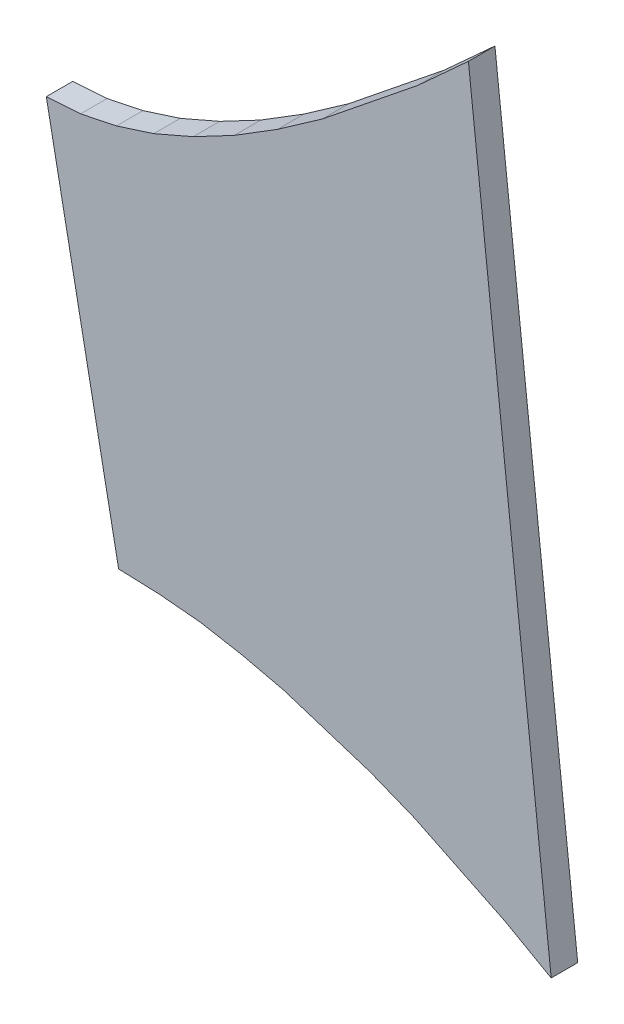
ISO-10303-21;
HEADER;
FILE_DESCRIPTION(('STEP AP214'),'2;1');
FILE_NAME('part.step','',(''),(''),'','','');
FILE_SCHEMA(('AUTOMOTIVE_DESIGN { 1 0 10303 214 1 1 1 1 }'));
ENDSEC;
DATA;
#1=APPLICATION_CONTEXT('core data for automotive mechanical design processes');
#2=APPLICATION_PROTOCOL_DEFINITION('international standard','automotive_design',2000,#1);
#3=PRODUCT_CONTEXT('',#1,'mechanical');
#4=PRODUCT('Part','Part','',(#3));
#5=PRODUCT_RELATED_PRODUCT_CATEGORY('part','',(#4));
#6=PRODUCT_DEFINITION_FORMATION('','',#4);
#7=PRODUCT_DEFINITION_CONTEXT('part definition',#1,'design');
#8=PRODUCT_DEFINITION('design','',#6,#7);
#9=PRODUCT_DEFINITION_SHAPE('','',#8);
#10=(LENGTH_UNIT() NAMED_UNIT(*) SI_UNIT(.MILLI.,.METRE.));
#11=(NAMED_UNIT(*) PLANE_ANGLE_UNIT() SI_UNIT($,.RADIAN.));
#12=(NAMED_UNIT(*) SI_UNIT($,.STERADIAN.) SOLID_ANGLE_UNIT());
#13=UNCERTAINTY_MEASURE_WITH_UNIT(LENGTH_MEASURE(1.E-05),#10,'distance_accuracy_value','');
#14=(GEOMETRIC_REPRESENTATION_CONTEXT(3) GLOBAL_UNCERTAINTY_ASSIGNED_CONTEXT((#13)) GLOBAL_UNIT_ASSIGNED_CONTEXT((#10,
#11,#12)) REPRESENTATION_CONTEXT('',''));
#15=CARTESIAN_POINT('',(0.,0.,0.));
#16=DIRECTION('',(0.,0.,1.));
#17=DIRECTION('',(1.,0.,0.));
#18=AXIS2_PLACEMENT_3D('',#15,#16,#17);
#19=CARTESIAN_POINT('',(49.7750015258789,85.5899963378906,0.));
#20=DIRECTION('',(0.0369933823763517,0.999315510567287,0.));
#21=DIRECTION('',(0.999315510567287,-0.0369933823763517,0.));
#22=AXIS2_PLACEMENT_3D('',#19,#20,#21);
#23=PLANE('',#22);
#24=DIRECTION('',(0.999315510567287,-0.0369933823763517,0.));
#25=VECTOR('',#24,1.);
#26=CARTESIAN_POINT('',(49.7750015258789,85.5899963378906,0.03556));
#27=LINE('',#26,#25);
#28=CARTESIAN_POINT('',(49.7750015258789,85.5899963378906,0.03556));
#29=VERTEX_POINT('',#28);
#30=CARTESIAN_POINT('',(49.8289985656738,85.5879974365234,0.03556));
#31=VERTEX_POINT('',#30);
#32=EDGE_CURVE('E11',#29,#31,#27,.T.);
#33=ORIENTED_EDGE('',*,*,#32,.F.);
#34=DIRECTION('',(0.,0.,1.));
#35=VECTOR('',#34,1.);
#36=CARTESIAN_POINT('',(49.7750015258789,85.5899963378906,0.));
#37=LINE('',#36,#35);
#38=CARTESIAN_POINT('',(49.7750015258789,85.5899963378906,0.));
#39=VERTEX_POINT('',#38);
#40=EDGE_CURVE('E24',#39,#29,#37,.T.);
#41=ORIENTED_EDGE('',*,*,#40,.F.);
#42=DIRECTION('',(0.999315510567287,-0.0369933823763517,0.));
#43=VECTOR('',#42,1.);
#44=CARTESIAN_POINT('',(49.7750015258789,85.5899963378906,0.));
#45=LINE('',#44,#43);
#46=CARTESIAN_POINT('',(49.8289985656738,85.5879974365234,0.));
#47=VERTEX_POINT('',#46);
#48=EDGE_CURVE('E166',#39,#47,#45,.T.);
#49=ORIENTED_EDGE('',*,*,#48,.T.);
#50=DIRECTION('',(0.,0.,1.));
#51=VECTOR('',#50,1.);
#52=CARTESIAN_POINT('',(49.8289985656738,85.5879974365234,0.));
#53=LINE('',#52,#51);
#54=EDGE_CURVE('E37',#47,#31,#53,.T.);
#55=ORIENTED_EDGE('',*,*,#54,.T.);
#56=EDGE_LOOP('',(#33,#41,#49,#55));
#57=FACE_BOUND('',#56,.T.);
#58=ADVANCED_FACE('F17',(#57),#23,.F.);
#59=CARTESIAN_POINT('',(49.8289985656738,85.5879974365234,0.));
#60=DIRECTION('',(0.090485922620555,0.995897734613101,0.));
#61=DIRECTION('',(0.995897734613101,-0.090485922620555,0.));
#62=AXIS2_PLACEMENT_3D('',#59,#60,#61);
#63=PLANE('',#62);
#64=DIRECTION('',(0.995897734613101,-0.090485922620555,0.));
#65=VECTOR('',#64,1.);
#66=CARTESIAN_POINT('',(49.8289985656738,85.5879974365234,0.03556));
#67=LINE('',#66,#65);
#68=CARTESIAN_POINT('',(49.8839988708496,85.5830001831055,0.03556));
#69=VERTEX_POINT('',#68);
#70=EDGE_CURVE('E294',#31,#69,#67,.T.);
#71=ORIENTED_EDGE('',*,*,#70,.F.);
#72=ORIENTED_EDGE('',*,*,#54,.F.);
#73=DIRECTION('',(0.995897734613101,-0.090485922620555,0.));
#74=VECTOR('',#73,1.);
#75=CARTESIAN_POINT('',(49.8289985656738,85.5879974365234,0.));
#76=LINE('',#75,#74);
#77=CARTESIAN_POINT('',(49.8839988708496,85.5830001831055,0.));
#78=VERTEX_POINT('',#77);
#79=EDGE_CURVE('E291',#47,#78,#76,.T.);
#80=ORIENTED_EDGE('',*,*,#79,.T.);
#81=DIRECTION('',(0.,0.,1.));
#82=VECTOR('',#81,1.);
#83=CARTESIAN_POINT('',(49.8839988708496,85.5830001831055,0.));
#84=LINE('',#83,#82);
#85=EDGE_CURVE('E289',#78,#69,#84,.T.);
#86=ORIENTED_EDGE('',*,*,#85,.T.);
#87=EDGE_LOOP('',(#71,#72,#80,#86));
#88=FACE_BOUND('',#87,.T.);
#89=ADVANCED_FACE('F302',(#88),#63,.F.);
#90=CARTESIAN_POINT('',(49.8839988708496,85.5830001831055,0.));
#91=DIRECTION('',(0.175827773431546,0.984420943545039,0.));
#92=DIRECTION('',(0.984420943545039,-0.175827773431546,0.));
#93=AXIS2_PLACEMENT_3D('',#90,#91,#92);
#94=PLANE('',#93);
#95=DIRECTION('',(0.984420943545039,-0.175827773431546,0.));
#96=VECTOR('',#95,1.);
#97=CARTESIAN_POINT('',(49.8839988708496,85.5830001831055,0.03556));
#98=LINE('',#97,#96);
#99=CARTESIAN_POINT('',(49.939998626709,85.572998046875,0.03556));
#100=VERTEX_POINT('',#99);
#101=EDGE_CURVE('E286',#69,#100,#98,.T.);
#102=ORIENTED_EDGE('',*,*,#101,.F.);
#103=ORIENTED_EDGE('',*,*,#85,.F.);
#104=DIRECTION('',(0.984420943545039,-0.175827773431546,0.));
#105=VECTOR('',#104,1.);
#106=CARTESIAN_POINT('',(49.8839988708496,85.5830001831055,0.));
#107=LINE('',#106,#105);
#108=CARTESIAN_POINT('',(49.939998626709,85.572998046875,0.));
#109=VERTEX_POINT('',#108);
#110=EDGE_CURVE('E283',#78,#109,#107,.T.);
#111=ORIENTED_EDGE('',*,*,#110,.T.);
#112=DIRECTION('',(0.,0.,1.));
#113=VECTOR('',#112,1.);
#114=CARTESIAN_POINT('',(49.939998626709,85.572998046875,0.));
#115=LINE('',#114,#113);
#116=EDGE_CURVE('E281',#109,#100,#115,.T.);
#117=ORIENTED_EDGE('',*,*,#116,.T.);
#118=EDGE_LOOP('',(#102,#103,#111,#117));
#119=FACE_BOUND('',#118,.T.);
#120=ADVANCED_FACE('F308',(#119),#94,.F.);
#121=CARTESIAN_POINT('',(49.939998626709,85.572998046875,0.));
#122=DIRECTION('',(0.226138701789796,0.974095112169662,0.));
#123=DIRECTION('',(0.974095112169662,-0.226138701789796,0.));
#124=AXIS2_PLACEMENT_3D('',#121,#122,#123);
#125=PLANE('',#124);
#126=DIRECTION('',(0.974095112169662,-0.226138701789796,0.));
#127=VECTOR('',#126,1.);
#128=CARTESIAN_POINT('',(49.939998626709,85.572998046875,0.03556));
#129=LINE('',#128,#127);
#130=CARTESIAN_POINT('',(49.9959983825684,85.5599975585938,0.03556));
#131=VERTEX_POINT('',#130);
#132=EDGE_CURVE('E278',#100,#131,#129,.T.);
#133=ORIENTED_EDGE('',*,*,#132,.F.);
#134=ORIENTED_EDGE('',*,*,#116,.F.);
#135=DIRECTION('',(0.974095112169662,-0.226138701789796,0.));
#136=VECTOR('',#135,1.);
#137=CARTESIAN_POINT('',(49.939998626709,85.572998046875,0.));
#138=LINE('',#137,#136);
#139=CARTESIAN_POINT('',(49.9959983825684,85.5599975585938,0.));
#140=VERTEX_POINT('',#139);
#141=EDGE_CURVE('E275',#109,#140,#138,.T.);
#142=ORIENTED_EDGE('',*,*,#141,.T.);
#143=DIRECTION('',(0.,0.,1.));
#144=VECTOR('',#143,1.);
#145=CARTESIAN_POINT('',(49.9959983825684,85.5599975585938,0.));
#146=LINE('',#145,#144);
#147=EDGE_CURVE('E273',#140,#131,#146,.T.);
#148=ORIENTED_EDGE('',*,*,#147,.T.);
#149=EDGE_LOOP('',(#133,#134,#142,#148));
#150=FACE_BOUND('',#149,.T.);
#151=ADVANCED_FACE('F310',(#150),#125,.F.);
#152=CARTESIAN_POINT('',(49.9959983825684,85.5599975585938,0.));
#153=DIRECTION('',(0.303841128440749,0.95272271342078,0.));
#154=DIRECTION('',(0.95272271342078,-0.303841128440749,0.));
#155=AXIS2_PLACEMENT_3D('',#152,#153,#154);
#156=PLANE('',#155);
#157=DIRECTION('',(0.952722713420779,-0.303841128440749,0.));
#158=VECTOR('',#157,1.);
#159=CARTESIAN_POINT('',(49.9959983825684,85.5599975585938,0.03556));
#160=LINE('',#159,#158);
#161=CARTESIAN_POINT('',(50.1119995117188,85.5230026245117,0.03556));
#162=VERTEX_POINT('',#161);
#163=EDGE_CURVE('E270',#131,#162,#160,.T.);
#164=ORIENTED_EDGE('',*,*,#163,.F.);
#165=ORIENTED_EDGE('',*,*,#147,.F.);
#166=DIRECTION('',(0.952722713420779,-0.303841128440749,0.));
#167=VECTOR('',#166,1.);
#168=CARTESIAN_POINT('',(49.9959983825684,85.5599975585938,0.));
#169=LINE('',#168,#167);
#170=CARTESIAN_POINT('',(50.1119995117188,85.5230026245117,0.));
#171=VERTEX_POINT('',#170);
#172=EDGE_CURVE('E267',#140,#171,#169,.T.);
#173=ORIENTED_EDGE('',*,*,#172,.T.);
#174=DIRECTION('',(0.,0.,1.));
#175=VECTOR('',#174,1.);
#176=CARTESIAN_POINT('',(50.1119995117188,85.5230026245117,0.));
#177=LINE('',#176,#175);
#178=EDGE_CURVE('E265',#171,#162,#177,.T.);
#179=ORIENTED_EDGE('',*,*,#178,.T.);
#180=EDGE_LOOP('',(#164,#165,#173,#179));
#181=FACE_BOUND('',#180,.T.);
#182=ADVANCED_FACE('F315',(#181),#156,.F.);
#183=CARTESIAN_POINT('',(50.1119995117188,85.5230026245117,0.));
#184=DIRECTION('',(0.371411031123304,0.928468548718762,0.));
#185=DIRECTION('',(0.928468548718762,-0.371411031123304,0.));
#186=AXIS2_PLACEMENT_3D('',#183,#184,#185);
#187=PLANE('',#186);
#188=DIRECTION('',(0.928468548718762,-0.371411031123304,0.));
#189=VECTOR('',#188,1.);
#190=CARTESIAN_POINT('',(50.1119995117188,85.5230026245117,0.03556));
#191=LINE('',#190,#189);
#192=CARTESIAN_POINT('',(50.1720008850098,85.4990005493164,0.03556));
#193=VERTEX_POINT('',#192);
#194=EDGE_CURVE('E262',#162,#193,#191,.T.);
#195=ORIENTED_EDGE('',*,*,#194,.F.);
#196=ORIENTED_EDGE('',*,*,#178,.F.);
#197=DIRECTION('',(0.928468548718762,-0.371411031123304,0.));
#198=VECTOR('',#197,1.);
#199=CARTESIAN_POINT('',(50.1119995117188,85.5230026245117,0.));
#200=LINE('',#199,#198);
#201=CARTESIAN_POINT('',(50.1720008850098,85.4990005493164,0.));
#202=VERTEX_POINT('',#201);
#203=EDGE_CURVE('E259',#171,#202,#200,.T.);
#204=ORIENTED_EDGE('',*,*,#203,.T.);
#205=DIRECTION('',(0.,0.,1.));
#206=VECTOR('',#205,1.);
#207=CARTESIAN_POINT('',(50.1720008850098,85.4990005493164,0.));
#208=LINE('',#207,#206);
#209=EDGE_CURVE('E257',#202,#193,#208,.T.);
#210=ORIENTED_EDGE('',*,*,#209,.T.);
#211=EDGE_LOOP('',(#195,#196,#204,#210));
#212=FACE_BOUND('',#211,.T.);
#213=ADVANCED_FACE('F318',(#212),#187,.F.);
#214=CARTESIAN_POINT('',(50.1720008850098,85.4990005493164,0.));
#215=DIRECTION('',(0.438270648466391,0.898843055651458,0.));
#216=DIRECTION('',(0.898843055651458,-0.438270648466391,0.));
#217=AXIS2_PLACEMENT_3D('',#214,#215,#216);
#218=PLANE('',#217);
#219=DIRECTION('',(0.898843055651458,-0.438270648466391,0.));
#220=VECTOR('',#219,1.);
#221=CARTESIAN_POINT('',(50.1720008850098,85.4990005493164,0.03556));
#222=LINE('',#221,#220);
#223=CARTESIAN_POINT('',(50.2929992675781,85.4400024414063,0.03556));
#224=VERTEX_POINT('',#223);
#225=EDGE_CURVE('E254',#193,#224,#222,.T.);
#226=ORIENTED_EDGE('',*,*,#225,.F.);
#227=ORIENTED_EDGE('',*,*,#209,.F.);
#228=DIRECTION('',(0.898843055651458,-0.438270648466391,0.));
#229=VECTOR('',#228,1.);
#230=CARTESIAN_POINT('',(50.1720008850098,85.4990005493164,0.));
#231=LINE('',#230,#229);
#232=CARTESIAN_POINT('',(50.2929992675781,85.4400024414063,0.));
#233=VERTEX_POINT('',#232);
#234=EDGE_CURVE('E251',#202,#233,#231,.T.);
#235=ORIENTED_EDGE('',*,*,#234,.T.);
#236=DIRECTION('',(0.,0.,1.));
#237=VECTOR('',#236,1.);
#238=CARTESIAN_POINT('',(50.2929992675781,85.4400024414063,0.));
#239=LINE('',#238,#237);
#240=EDGE_CURVE('E249',#233,#224,#239,.T.);
#241=ORIENTED_EDGE('',*,*,#240,.T.);
#242=EDGE_LOOP('',(#226,#227,#235,#241));
#243=FACE_BOUND('',#242,.T.);
#244=ADVANCED_FACE('F323',(#243),#218,.F.);
#245=CARTESIAN_POINT('',(50.2929992675781,85.4400024414063,0.));
#246=DIRECTION('',(0.491631721038218,0.870803221668937,0.));
#247=DIRECTION('',(0.870803221668937,-0.491631721038218,0.));
#248=AXIS2_PLACEMENT_3D('',#245,#246,#247);
#249=PLANE('',#248);
#250=DIRECTION('',(0.870803221668937,-0.491631721038218,0.));
#251=VECTOR('',#250,1.);
#252=CARTESIAN_POINT('',(50.2929992675781,85.4400024414063,0.03556));
#253=LINE('',#252,#251);
#254=CARTESIAN_POINT('',(50.3549995422363,85.4049987792969,0.03556));
#255=VERTEX_POINT('',#254);
#256=EDGE_CURVE('E246',#224,#255,#253,.T.);
#257=ORIENTED_EDGE('',*,*,#256,.F.);
#258=ORIENTED_EDGE('',*,*,#240,.F.);
#259=DIRECTION('',(0.870803221668937,-0.491631721038218,0.));
#260=VECTOR('',#259,1.);
#261=CARTESIAN_POINT('',(50.2929992675781,85.4400024414063,0.));
#262=LINE('',#261,#260);
#263=CARTESIAN_POINT('',(50.3549995422363,85.4049987792969,0.));
#264=VERTEX_POINT('',#263);
#265=EDGE_CURVE('E243',#233,#264,#262,.T.);
#266=ORIENTED_EDGE('',*,*,#265,.T.);
#267=DIRECTION('',(0.,0.,1.));
#268=VECTOR('',#267,1.);
#269=CARTESIAN_POINT('',(50.3549995422363,85.4049987792969,0.));
#270=LINE('',#269,#268);
#271=EDGE_CURVE('E241',#264,#255,#270,.T.);
#272=ORIENTED_EDGE('',*,*,#271,.T.);
#273=EDGE_LOOP('',(#257,#258,#266,#272));
#274=FACE_BOUND('',#273,.T.);
#275=ADVANCED_FACE('F326',(#274),#249,.F.);
#276=CARTESIAN_POINT('',(50.3549995422363,85.4049987792969,0.));
#277=DIRECTION('',(-0.994003310291819,-0.109349984585758,0.));
#278=DIRECTION('',(-0.109349984585758,0.994003310291819,0.));
#279=AXIS2_PLACEMENT_3D('',#276,#277,#278);
#280=PLANE('',#279);
#281=DIRECTION('',(-0.109349984585758,0.994003310291819,0.));
#282=VECTOR('',#281,1.);
#283=CARTESIAN_POINT('',(50.3549995422363,85.4049987792969,0.03556));
#284=LINE('',#283,#282);
#285=CARTESIAN_POINT('',(50.2439994812012,86.4140014648438,0.03556));
#286=VERTEX_POINT('',#285);
#287=EDGE_CURVE('E238',#255,#286,#284,.T.);
#288=ORIENTED_EDGE('',*,*,#287,.F.);
#289=ORIENTED_EDGE('',*,*,#271,.F.);
#290=DIRECTION('',(-0.109349984585758,0.994003310291819,0.));
#291=VECTOR('',#290,1.);
#292=CARTESIAN_POINT('',(50.3549995422363,85.4049987792969,0.));
#293=LINE('',#292,#291);
#294=CARTESIAN_POINT('',(50.2439994812012,86.4140014648438,0.));
#295=VERTEX_POINT('',#294);
#296=EDGE_CURVE('E235',#264,#295,#293,.T.);
#297=ORIENTED_EDGE('',*,*,#296,.T.);
#298=DIRECTION('',(0.,0.,1.));
#299=VECTOR('',#298,1.);
#300=CARTESIAN_POINT('',(50.2439994812012,86.4140014648438,0.));
#301=LINE('',#300,#299);
#302=EDGE_CURVE('E233',#295,#286,#301,.T.);
#303=ORIENTED_EDGE('',*,*,#302,.T.);
#304=EDGE_LOOP('',(#288,#289,#297,#303));
#305=FACE_BOUND('',#304,.T.);
#306=ADVANCED_FACE('F331',(#305),#280,.F.);
#307=CARTESIAN_POINT('',(50.2439994812012,86.4140014648438,0.));
#308=DIRECTION('',(0.673773829974865,-0.738937633390669,0.));
#309=DIRECTION('',(-0.738937633390669,-0.673773829974865,0.));
#310=AXIS2_PLACEMENT_3D('',#307,#308,#309);
#311=PLANE('',#310);
#312=DIRECTION('',(-0.738937633390669,-0.673773829974865,0.));
#313=VECTOR('',#312,1.);
#314=CARTESIAN_POINT('',(50.2439994812012,86.4140014648438,0.03556));
#315=LINE('',#314,#313);
#316=CARTESIAN_POINT('',(50.1759986877441,86.3519973754883,0.03556));
#317=VERTEX_POINT('',#316);
#318=EDGE_CURVE('E230',#286,#317,#315,.T.);
#319=ORIENTED_EDGE('',*,*,#318,.F.);
#320=ORIENTED_EDGE('',*,*,#302,.F.);
#321=DIRECTION('',(-0.738937633390669,-0.673773829974865,0.));
#322=VECTOR('',#321,1.);
#323=CARTESIAN_POINT('',(50.2439994812012,86.4140014648438,0.));
#324=LINE('',#323,#322);
#325=CARTESIAN_POINT('',(50.1759986877441,86.3519973754883,0.));
#326=VERTEX_POINT('',#325);
#327=EDGE_CURVE('E227',#295,#326,#324,.T.);
#328=ORIENTED_EDGE('',*,*,#327,.T.);
#329=DIRECTION('',(0.,0.,1.));
#330=VECTOR('',#329,1.);
#331=CARTESIAN_POINT('',(50.1759986877441,86.3519973754883,0.));
#332=LINE('',#331,#330);
#333=EDGE_CURVE('E225',#326,#317,#332,.T.);
#334=ORIENTED_EDGE('',*,*,#333,.T.);
#335=EDGE_LOOP('',(#319,#320,#328,#334));
#336=FACE_BOUND('',#335,.T.);
#337=ADVANCED_FACE('F334',(#336),#311,.F.);
#338=CARTESIAN_POINT('',(50.1759986877441,86.3519973754883,0.));
#339=DIRECTION('',(0.626912484165403,-0.779089684951331,0.));
#340=DIRECTION('',(-0.779089684951331,-0.626912484165403,0.));
#341=AXIS2_PLACEMENT_3D('',#338,#339,#340);
#342=PLANE('',#341);
#343=DIRECTION('',(-0.779089684951331,-0.626912484165403,0.));
#344=VECTOR('',#343,1.);
#345=CARTESIAN_POINT('',(50.1759986877441,86.3519973754883,0.03556));
#346=LINE('',#345,#344);
#347=CARTESIAN_POINT('',(50.0480003356934,86.2490005493164,0.03556));
#348=VERTEX_POINT('',#347);
#349=EDGE_CURVE('E222',#317,#348,#346,.T.);
#350=ORIENTED_EDGE('',*,*,#349,.F.);
#351=ORIENTED_EDGE('',*,*,#333,.F.);
#352=DIRECTION('',(-0.779089684951331,-0.626912484165403,0.));
#353=VECTOR('',#352,1.);
#354=CARTESIAN_POINT('',(50.1759986877441,86.3519973754883,0.));
#355=LINE('',#354,#353);
#356=CARTESIAN_POINT('',(50.0480003356934,86.2490005493164,0.));
#357=VERTEX_POINT('',#356);
#358=EDGE_CURVE('E219',#326,#357,#355,.T.);
#359=ORIENTED_EDGE('',*,*,#358,.T.);
#360=DIRECTION('',(0.,0.,1.));
#361=VECTOR('',#360,1.);
#362=CARTESIAN_POINT('',(50.0480003356934,86.2490005493164,0.));
#363=LINE('',#362,#361);
#364=EDGE_CURVE('E217',#357,#348,#363,.T.);
#365=ORIENTED_EDGE('',*,*,#364,.T.);
#366=EDGE_LOOP('',(#350,#351,#359,#365));
#367=FACE_BOUND('',#366,.T.);
#368=ADVANCED_FACE('F339',(#367),#342,.F.);
#369=CARTESIAN_POINT('',(50.0480003356934,86.2490005493164,0.));
#370=DIRECTION('',(0.573451857476605,-0.819239261239738,0.));
#371=DIRECTION('',(-0.819239261239738,-0.573451857476605,0.));
#372=AXIS2_PLACEMENT_3D('',#369,#370,#371);
#373=PLANE('',#372);
#374=DIRECTION('',(-0.819239261239738,-0.573451857476605,0.));
#375=VECTOR('',#374,1.);
#376=CARTESIAN_POINT('',(50.0480003356934,86.2490005493164,0.03556));
#377=LINE('',#376,#375);
#378=CARTESIAN_POINT('',(49.9879989624023,86.2070007324219,0.03556));
#379=VERTEX_POINT('',#378);
#380=EDGE_CURVE('E214',#348,#379,#377,.T.);
#381=ORIENTED_EDGE('',*,*,#380,.F.);
#382=ORIENTED_EDGE('',*,*,#364,.F.);
#383=DIRECTION('',(-0.819239261239738,-0.573451857476605,0.));
#384=VECTOR('',#383,1.);
#385=CARTESIAN_POINT('',(50.0480003356934,86.2490005493164,0.));
#386=LINE('',#385,#384);
#387=CARTESIAN_POINT('',(49.9879989624023,86.2070007324219,0.));
#388=VERTEX_POINT('',#387);
#389=EDGE_CURVE('E211',#357,#388,#386,.T.);
#390=ORIENTED_EDGE('',*,*,#389,.T.);
#391=DIRECTION('',(0.,0.,1.));
#392=VECTOR('',#391,1.);
#393=CARTESIAN_POINT('',(49.9879989624023,86.2070007324219,0.));
#394=LINE('',#393,#392);
#395=EDGE_CURVE('E209',#388,#379,#394,.T.);
#396=ORIENTED_EDGE('',*,*,#395,.T.);
#397=EDGE_LOOP('',(#381,#382,#390,#396));
#398=FACE_BOUND('',#397,.T.);
#399=ADVANCED_FACE('F342',(#398),#373,.F.);
#400=CARTESIAN_POINT('',(49.9879989624023,86.2070007324219,0.));
#401=DIRECTION('',(0.527404591994951,-0.849614263264594,0.));
#402=DIRECTION('',(-0.849614263264594,-0.527404591994951,0.));
#403=AXIS2_PLACEMENT_3D('',#400,#401,#402);
#404=PLANE('',#403);
#405=DIRECTION('',(-0.849614263264594,-0.527404591994951,0.));
#406=VECTOR('',#405,1.);
#407=CARTESIAN_POINT('',(49.9879989624023,86.2070007324219,0.03556));
#408=LINE('',#407,#406);
#409=CARTESIAN_POINT('',(49.9300003051758,86.1709976196289,0.03556));
#410=VERTEX_POINT('',#409);
#411=EDGE_CURVE('E206',#379,#410,#408,.T.);
#412=ORIENTED_EDGE('',*,*,#411,.F.);
#413=ORIENTED_EDGE('',*,*,#395,.F.);
#414=DIRECTION('',(-0.849614263264594,-0.527404591994951,0.));
#415=VECTOR('',#414,1.);
#416=CARTESIAN_POINT('',(49.9879989624023,86.2070007324219,0.));
#417=LINE('',#416,#415);
#418=CARTESIAN_POINT('',(49.9300003051758,86.1709976196289,0.));
#419=VERTEX_POINT('',#418);
#420=EDGE_CURVE('E203',#388,#419,#417,.T.);
#421=ORIENTED_EDGE('',*,*,#420,.T.);
#422=DIRECTION('',(0.,0.,1.));
#423=VECTOR('',#422,1.);
#424=CARTESIAN_POINT('',(49.9300003051758,86.1709976196289,0.));
#425=LINE('',#424,#423);
#426=EDGE_CURVE('E201',#419,#410,#425,.T.);
#427=ORIENTED_EDGE('',*,*,#426,.T.);
#428=EDGE_LOOP('',(#412,#413,#421,#427));
#429=FACE_BOUND('',#428,.T.);
#430=ADVANCED_FACE('F347',(#429),#404,.F.);
#431=CARTESIAN_POINT('',(49.9300003051758,86.1709976196289,0.));
#432=DIRECTION('',(0.466398688066183,-0.884574623064749,0.));
#433=DIRECTION('',(-0.884574623064749,-0.466398688066183,0.));
#434=AXIS2_PLACEMENT_3D('',#431,#432,#433);
#435=PLANE('',#434);
#436=DIRECTION('',(-0.884574623064749,-0.466398688066183,0.));
#437=VECTOR('',#436,1.);
#438=CARTESIAN_POINT('',(49.9300003051758,86.1709976196289,0.03556));
#439=LINE('',#438,#437);
#440=CARTESIAN_POINT('',(49.875,86.1419982910156,0.03556));
#441=VERTEX_POINT('',#440);
#442=EDGE_CURVE('E198',#410,#441,#439,.T.);
#443=ORIENTED_EDGE('',*,*,#442,.F.);
#444=ORIENTED_EDGE('',*,*,#426,.F.);
#445=DIRECTION('',(-0.884574623064749,-0.466398688066183,0.));
#446=VECTOR('',#445,1.);
#447=CARTESIAN_POINT('',(49.9300003051758,86.1709976196289,0.));
#448=LINE('',#447,#446);
#449=CARTESIAN_POINT('',(49.875,86.1419982910156,0.));
#450=VERTEX_POINT('',#449);
#451=EDGE_CURVE('E195',#419,#450,#448,.T.);
#452=ORIENTED_EDGE('',*,*,#451,.T.);
#453=DIRECTION('',(0.,0.,1.));
#454=VECTOR('',#453,1.);
#455=CARTESIAN_POINT('',(49.875,86.1419982910156,0.));
#456=LINE('',#455,#454);
#457=EDGE_CURVE('E193',#450,#441,#456,.T.);
#458=ORIENTED_EDGE('',*,*,#457,.T.);
#459=EDGE_LOOP('',(#443,#444,#452,#458));
#460=FACE_BOUND('',#459,.T.);
#461=ADVANCED_FACE('F350',(#460),#435,.F.);
#462=CARTESIAN_POINT('',(49.875,86.1419982910156,0.));
#463=DIRECTION('',(0.398011344116063,-0.917380493554842,0.));
#464=DIRECTION('',(-0.917380493554842,-0.398011344116063,0.));
#465=AXIS2_PLACEMENT_3D('',#462,#463,#464);
#466=PLANE('',#465);
#467=DIRECTION('',(-0.917380493554842,-0.398011344116063,0.));
#468=VECTOR('',#467,1.);
#469=CARTESIAN_POINT('',(49.875,86.1419982910156,0.03556));
#470=LINE('',#469,#468);
#471=CARTESIAN_POINT('',(49.8219985961914,86.1190032958984,0.03556));
#472=VERTEX_POINT('',#471);
#473=EDGE_CURVE('E190',#441,#472,#470,.T.);
#474=ORIENTED_EDGE('',*,*,#473,.F.);
#475=ORIENTED_EDGE('',*,*,#457,.F.);
#476=DIRECTION('',(-0.917380493554842,-0.398011344116063,0.));
#477=VECTOR('',#476,1.);
#478=CARTESIAN_POINT('',(49.875,86.1419982910156,0.));
#479=LINE('',#478,#477);
#480=CARTESIAN_POINT('',(49.8219985961914,86.1190032958984,0.));
#481=VERTEX_POINT('',#480);
#482=EDGE_CURVE('E187',#450,#481,#479,.T.);
#483=ORIENTED_EDGE('',*,*,#482,.T.);
#484=DIRECTION('',(0.,0.,1.));
#485=VECTOR('',#484,1.);
#486=CARTESIAN_POINT('',(49.8219985961914,86.1190032958984,0.));
#487=LINE('',#486,#485);
#488=EDGE_CURVE('E185',#481,#472,#487,.T.);
#489=ORIENTED_EDGE('',*,*,#488,.T.);
#490=EDGE_LOOP('',(#474,#475,#483,#489));
#491=FACE_BOUND('',#490,.T.);
#492=ADVANCED_FACE('F355',(#491),#466,.F.);
#493=CARTESIAN_POINT('',(49.8219985961914,86.1190032958984,0.));
#494=DIRECTION('',(0.304891731692046,-0.952387017942719,0.));
#495=DIRECTION('',(-0.952387017942719,-0.304891731692046,0.));
#496=AXIS2_PLACEMENT_3D('',#493,#494,#495);
#497=PLANE('',#496);
#498=DIRECTION('',(-0.952387017942719,-0.304891731692046,0.));
#499=VECTOR('',#498,1.);
#500=CARTESIAN_POINT('',(49.8219985961914,86.1190032958984,0.03556));
#501=LINE('',#500,#499);
#502=CARTESIAN_POINT('',(49.7719993591309,86.1029968261719,0.03556));
#503=VERTEX_POINT('',#502);
#504=EDGE_CURVE('E182',#472,#503,#501,.T.);
#505=ORIENTED_EDGE('',*,*,#504,.F.);
#506=ORIENTED_EDGE('',*,*,#488,.F.);
#507=DIRECTION('',(-0.952387017942719,-0.304891731692046,0.));
#508=VECTOR('',#507,1.);
#509=CARTESIAN_POINT('',(49.8219985961914,86.1190032958984,0.));
#510=LINE('',#509,#508);
#511=CARTESIAN_POINT('',(49.7719993591309,86.1029968261719,0.));
#512=VERTEX_POINT('',#511);
#513=EDGE_CURVE('E179',#481,#512,#510,.T.);
#514=ORIENTED_EDGE('',*,*,#513,.T.);
#515=DIRECTION('',(0.,0.,1.));
#516=VECTOR('',#515,1.);
#517=CARTESIAN_POINT('',(49.7719993591309,86.1029968261719,0.));
#518=LINE('',#517,#516);
#519=EDGE_CURVE('E177',#512,#503,#518,.T.);
#520=ORIENTED_EDGE('',*,*,#519,.T.);
#521=EDGE_LOOP('',(#505,#506,#514,#520));
#522=FACE_BOUND('',#521,.T.);
#523=ADVANCED_FACE('F358',(#522),#497,.F.);
#524=CARTESIAN_POINT('',(49.7719993591309,86.1029968261719,0.));
#525=DIRECTION('',(0.203845509012343,-0.979003068665006,0.));
#526=DIRECTION('',(-0.979003068665006,-0.203845509012343,0.));
#527=AXIS2_PLACEMENT_3D('',#524,#525,#526);
#528=PLANE('',#527);
#529=DIRECTION('',(-0.979003068665006,-0.203845509012343,0.));
#530=VECTOR('',#529,1.);
#531=CARTESIAN_POINT('',(49.7719993591309,86.1029968261719,0.03556));
#532=LINE('',#531,#530);
#533=CARTESIAN_POINT('',(49.7239990234375,86.0930023193359,0.03556));
#534=VERTEX_POINT('',#533);
#535=EDGE_CURVE('E174',#503,#534,#532,.T.);
#536=ORIENTED_EDGE('',*,*,#535,.F.);
#537=ORIENTED_EDGE('',*,*,#519,.F.);
#538=DIRECTION('',(-0.979003068665006,-0.203845509012343,0.));
#539=VECTOR('',#538,1.);
#540=CARTESIAN_POINT('',(49.7719993591309,86.1029968261719,0.));
#541=LINE('',#540,#539);
#542=CARTESIAN_POINT('',(49.7239990234375,86.0930023193359,0.));
#543=VERTEX_POINT('',#542);
#544=EDGE_CURVE('E172',#512,#543,#541,.T.);
#545=ORIENTED_EDGE('',*,*,#544,.T.);
#546=DIRECTION('',(0.,0.,1.));
#547=VECTOR('',#546,1.);
#548=CARTESIAN_POINT('',(49.7239990234375,86.0930023193359,0.));
#549=LINE('',#548,#547);
#550=EDGE_CURVE('E157',#543,#534,#549,.T.);
#551=ORIENTED_EDGE('',*,*,#550,.T.);
#552=EDGE_LOOP('',(#536,#537,#545,#551));
#553=FACE_BOUND('',#552,.T.);
#554=ADVANCED_FACE('F361',(#553),#528,.F.);
#555=CARTESIAN_POINT('',(49.7239990234375,86.0930023193359,0.));
#556=DIRECTION('',(0.0652117020946669,-0.997871451595804,0.));
#557=DIRECTION('',(-0.997871451595804,-0.0652117020946669,0.));
#558=AXIS2_PLACEMENT_3D('',#555,#556,#557);
#559=PLANE('',#558);
#560=DIRECTION('',(-0.997871451595804,-0.0652117020946669,0.));
#561=VECTOR('',#560,1.);
#562=CARTESIAN_POINT('',(49.7239990234375,86.0930023193359,0.03556));
#563=LINE('',#562,#561);
#564=CARTESIAN_POINT('',(49.6780014038086,86.0899963378906,0.03556));
#565=VERTEX_POINT('',#564);
#566=EDGE_CURVE('E161',#534,#565,#563,.T.);
#567=ORIENTED_EDGE('',*,*,#566,.F.);
#568=ORIENTED_EDGE('',*,*,#550,.F.);
#569=DIRECTION('',(-0.997871451595804,-0.0652117020946669,0.));
#570=VECTOR('',#569,1.);
#571=CARTESIAN_POINT('',(49.7239990234375,86.0930023193359,0.));
#572=LINE('',#571,#570);
#573=CARTESIAN_POINT('',(49.6780014038086,86.0899963378906,0.));
#574=VERTEX_POINT('',#573);
#575=EDGE_CURVE('E153',#543,#574,#572,.T.);
#576=ORIENTED_EDGE('',*,*,#575,.T.);
#577=DIRECTION('',(0.,0.,1.));
#578=VECTOR('',#577,1.);
#579=CARTESIAN_POINT('',(49.6780014038086,86.0899963378906,0.));
#580=LINE('',#579,#578);
#581=EDGE_CURVE('E143',#574,#565,#580,.T.);
#582=ORIENTED_EDGE('',*,*,#581,.T.);
#583=EDGE_LOOP('',(#567,#568,#576,#582));
#584=FACE_BOUND('',#583,.T.);
#585=ADVANCED_FACE('F156',(#584),#559,.F.);
#586=CARTESIAN_POINT('',(49.6780014038086,86.0899963378906,0.));
#587=DIRECTION('',(0.981697002092681,0.1904494580781,0.));
#588=DIRECTION('',(0.1904494580781,-0.981697002092681,0.));
#589=AXIS2_PLACEMENT_3D('',#586,#587,#588);
#590=PLANE('',#589);
#591=DIRECTION('',(0.1904494580781,-0.981697002092681,0.));
#592=VECTOR('',#591,1.);
#593=CARTESIAN_POINT('',(49.6780014038086,86.0899963378906,0.03556));
#594=LINE('',#593,#592);
#595=EDGE_CURVE('E149',#565,#29,#594,.T.);
#596=ORIENTED_EDGE('',*,*,#595,.F.);
#597=ORIENTED_EDGE('',*,*,#581,.F.);
#598=DIRECTION('',(0.1904494580781,-0.981697002092681,0.));
#599=VECTOR('',#598,1.);
#600=CARTESIAN_POINT('',(49.6780014038086,86.0899963378906,0.));
#601=LINE('',#600,#599);
#602=EDGE_CURVE('E147',#574,#39,#601,.T.);
#603=ORIENTED_EDGE('',*,*,#602,.T.);
#604=ORIENTED_EDGE('',*,*,#40,.T.);
#605=EDGE_LOOP('',(#596,#597,#603,#604));
#606=FACE_BOUND('',#605,.T.);
#607=ADVANCED_FACE('F145',(#606),#590,.F.);
#608=CARTESIAN_POINT('',(49.7750015258789,85.5899963378906,0.));
#609=DIRECTION('',(0.,0.,1.));
#610=DIRECTION('',(1.,0.,0.));
#611=AXIS2_PLACEMENT_3D('',#608,#609,#610);
#612=PLANE('',#611);
#613=ORIENTED_EDGE('',*,*,#602,.F.);
#614=ORIENTED_EDGE('',*,*,#575,.F.);
#615=ORIENTED_EDGE('',*,*,#544,.F.);
#616=ORIENTED_EDGE('',*,*,#513,.F.);
#617=ORIENTED_EDGE('',*,*,#482,.F.);
#618=ORIENTED_EDGE('',*,*,#451,.F.);
#619=ORIENTED_EDGE('',*,*,#420,.F.);
#620=ORIENTED_EDGE('',*,*,#389,.F.);
#621=ORIENTED_EDGE('',*,*,#358,.F.);
#622=ORIENTED_EDGE('',*,*,#327,.F.);
#623=ORIENTED_EDGE('',*,*,#296,.F.);
#624=ORIENTED_EDGE('',*,*,#265,.F.);
#625=ORIENTED_EDGE('',*,*,#234,.F.);
#626=ORIENTED_EDGE('',*,*,#203,.F.);
#627=ORIENTED_EDGE('',*,*,#172,.F.);
#628=ORIENTED_EDGE('',*,*,#141,.F.);
#629=ORIENTED_EDGE('',*,*,#110,.F.);
#630=ORIENTED_EDGE('',*,*,#79,.F.);
#631=ORIENTED_EDGE('',*,*,#48,.F.);
#632=EDGE_LOOP('',(#613,#614,#615,#616,#617,#618,#619,#620,#621,#622,#623,#624,#625,#626,#627,
#628,#629,#630,#631));
#633=FACE_BOUND('',#632,.T.);
#634=ADVANCED_FACE('F164',(#633),#612,.F.);
#635=CARTESIAN_POINT('',(49.7750015258789,85.5899963378906,0.03556));
#636=DIRECTION('',(0.,0.,1.));
#637=DIRECTION('',(1.,0.,0.));
#638=AXIS2_PLACEMENT_3D('',#635,#636,#637);
#639=PLANE('',#638);
#640=ORIENTED_EDGE('',*,*,#32,.T.);
#641=ORIENTED_EDGE('',*,*,#70,.T.);
#642=ORIENTED_EDGE('',*,*,#101,.T.);
#643=ORIENTED_EDGE('',*,*,#132,.T.);
#644=ORIENTED_EDGE('',*,*,#163,.T.);
#645=ORIENTED_EDGE('',*,*,#194,.T.);
#646=ORIENTED_EDGE('',*,*,#225,.T.);
#647=ORIENTED_EDGE('',*,*,#256,.T.);
#648=ORIENTED_EDGE('',*,*,#287,.T.);
#649=ORIENTED_EDGE('',*,*,#318,.T.);
#650=ORIENTED_EDGE('',*,*,#349,.T.);
#651=ORIENTED_EDGE('',*,*,#380,.T.);
#652=ORIENTED_EDGE('',*,*,#411,.T.);
#653=ORIENTED_EDGE('',*,*,#442,.T.);
#654=ORIENTED_EDGE('',*,*,#473,.T.);
#655=ORIENTED_EDGE('',*,*,#504,.T.);
#656=ORIENTED_EDGE('',*,*,#535,.T.);
#657=ORIENTED_EDGE('',*,*,#566,.T.);
#658=ORIENTED_EDGE('',*,*,#595,.T.);
#659=EDGE_LOOP('',(#640,#641,#642,#643,#644,#645,#646,#647,#648,#649,#650,#651,#652,#653,#654,
#655,#656,#657,#658));
#660=FACE_BOUND('',#659,.T.);
#661=ADVANCED_FACE('F305',(#660),#639,.T.);
#662=CLOSED_SHELL('',(#58,#89,#120,#151,#182,#213,#244,#275,#306,#337,#368,#399,#430,#461,#492,
#523,#554,#585,#607,#634,#661));
#663=MANIFOLD_SOLID_BREP('B1',#662);
#664=ADVANCED_BREP_SHAPE_REPRESENTATION('',(#18,#663),#14);
#665=SHAPE_DEFINITION_REPRESENTATION(#9,#664);
ENDSEC;
END-ISO-10303-21;
